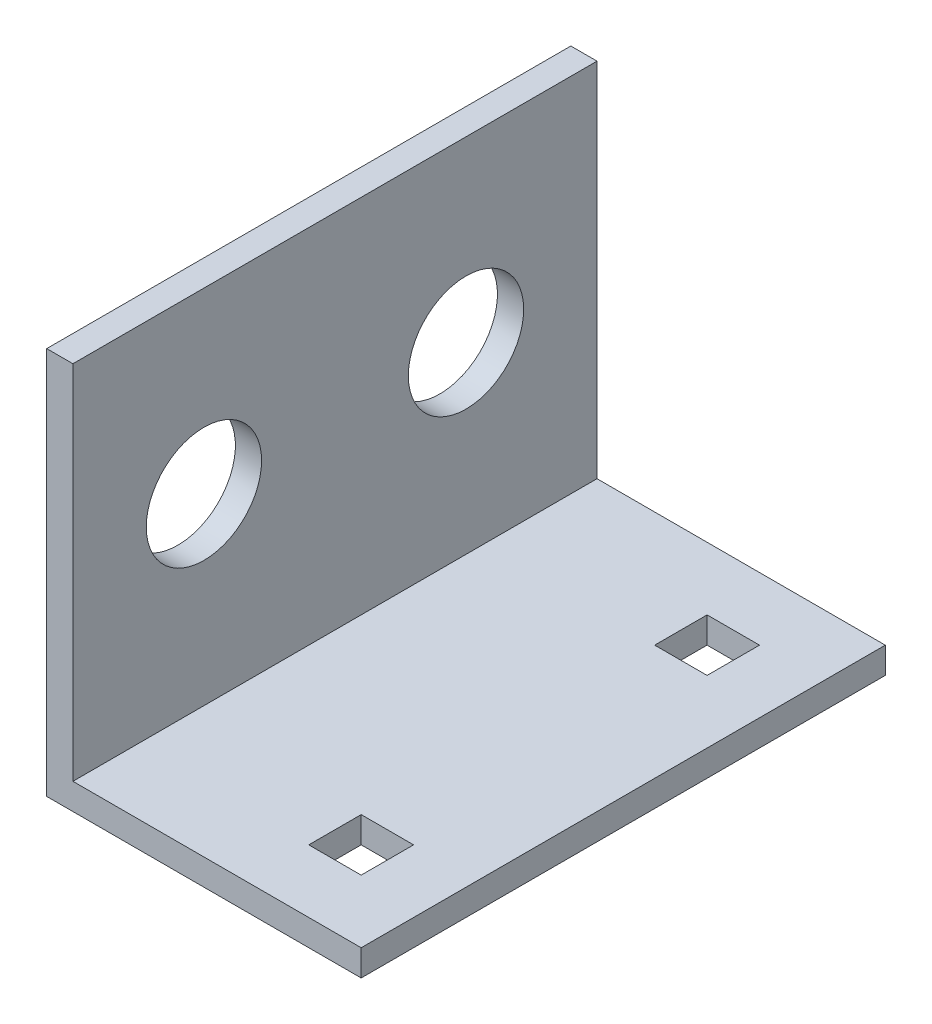
ISO-10303-21;
HEADER;
FILE_DESCRIPTION(('STEP AP214'),'2;1');
FILE_NAME('part.step','',(''),(''),'','','');
FILE_SCHEMA(('AUTOMOTIVE_DESIGN { 1 0 10303 214 1 1 1 1 }'));
ENDSEC;
DATA;
#1=APPLICATION_CONTEXT('core data for automotive mechanical design processes');
#2=APPLICATION_PROTOCOL_DEFINITION('international standard','automotive_design',2000,#1);
#3=PRODUCT_CONTEXT('',#1,'mechanical');
#4=PRODUCT('Part','Part','',(#3));
#5=PRODUCT_RELATED_PRODUCT_CATEGORY('part','',(#4));
#6=PRODUCT_DEFINITION_FORMATION('','',#4);
#7=PRODUCT_DEFINITION_CONTEXT('part definition',#1,'design');
#8=PRODUCT_DEFINITION('design','',#6,#7);
#9=PRODUCT_DEFINITION_SHAPE('','',#8);
#10=(LENGTH_UNIT() NAMED_UNIT(*) SI_UNIT(.MILLI.,.METRE.));
#11=(NAMED_UNIT(*) PLANE_ANGLE_UNIT() SI_UNIT($,.RADIAN.));
#12=(NAMED_UNIT(*) SI_UNIT($,.STERADIAN.) SOLID_ANGLE_UNIT());
#13=UNCERTAINTY_MEASURE_WITH_UNIT(LENGTH_MEASURE(1.E-05),#10,'distance_accuracy_value','');
#14=(GEOMETRIC_REPRESENTATION_CONTEXT(3) GLOBAL_UNCERTAINTY_ASSIGNED_CONTEXT((#13)) GLOBAL_UNIT_ASSIGNED_CONTEXT((#10,
#11,#12)) REPRESENTATION_CONTEXT('',''));
#15=CARTESIAN_POINT('',(0.,0.,0.));
#16=DIRECTION('',(0.,0.,1.));
#17=DIRECTION('',(1.,0.,0.));
#18=AXIS2_PLACEMENT_3D('',#15,#16,#17);
#19=CARTESIAN_POINT('',(0.,0.,-50.));
#20=DIRECTION('',(0.,-1.,0.));
#21=DIRECTION('',(0.,0.,-1.));
#22=AXIS2_PLACEMENT_3D('',#19,#20,#21);
#23=PLANE('',#22);
#24=DIRECTION('',(0.,0.,1.));
#25=VECTOR('',#24,1.);
#26=CARTESIAN_POINT('',(24.,0.,-44.));
#27=LINE('',#26,#25);
#28=CARTESIAN_POINT('',(24.,0.,-44.));
#29=VERTEX_POINT('',#28);
#30=CARTESIAN_POINT('',(24.,0.,-39.));
#31=VERTEX_POINT('',#30);
#32=EDGE_CURVE('E47',#29,#31,#27,.T.);
#33=ORIENTED_EDGE('',*,*,#32,.F.);
#34=DIRECTION('',(1.,0.,0.));
#35=VECTOR('',#34,1.);
#36=CARTESIAN_POINT('',(24.,0.,-44.));
#37=LINE('',#36,#35);
#38=CARTESIAN_POINT('',(19.,0.,-44.));
#39=VERTEX_POINT('',#38);
#40=EDGE_CURVE('E151',#39,#29,#37,.T.);
#41=ORIENTED_EDGE('',*,*,#40,.F.);
#42=DIRECTION('',(0.,0.,-1.));
#43=VECTOR('',#42,1.);
#44=CARTESIAN_POINT('',(19.,0.,-44.));
#45=LINE('',#44,#43);
#46=CARTESIAN_POINT('',(19.,0.,-39.));
#47=VERTEX_POINT('',#46);
#48=EDGE_CURVE('E136',#47,#39,#45,.T.);
#49=ORIENTED_EDGE('',*,*,#48,.F.);
#50=DIRECTION('',(-1.,0.,0.));
#51=VECTOR('',#50,1.);
#52=CARTESIAN_POINT('',(24.,0.,-39.));
#53=LINE('',#52,#51);
#54=EDGE_CURVE('E145',#31,#47,#53,.T.);
#55=ORIENTED_EDGE('',*,*,#54,.F.);
#56=EDGE_LOOP('',(#33,#41,#49,#55));
#57=FACE_BOUND('',#56,.T.);
#58=DIRECTION('',(0.,0.,1.));
#59=VECTOR('',#58,1.);
#60=CARTESIAN_POINT('',(24.,0.,-6.));
#61=LINE('',#60,#59);
#62=CARTESIAN_POINT('',(24.,0.,-11.));
#63=VERTEX_POINT('',#62);
#64=CARTESIAN_POINT('',(24.,0.,-6.));
#65=VERTEX_POINT('',#64);
#66=EDGE_CURVE('E158',#63,#65,#61,.T.);
#67=ORIENTED_EDGE('',*,*,#66,.F.);
#68=DIRECTION('',(1.,0.,0.));
#69=VECTOR('',#68,1.);
#70=CARTESIAN_POINT('',(24.,0.,-11.));
#71=LINE('',#70,#69);
#72=CARTESIAN_POINT('',(19.,0.,-11.));
#73=VERTEX_POINT('',#72);
#74=EDGE_CURVE('E168',#73,#63,#71,.T.);
#75=ORIENTED_EDGE('',*,*,#74,.F.);
#76=DIRECTION('',(0.,0.,-1.));
#77=VECTOR('',#76,1.);
#78=CARTESIAN_POINT('',(19.,0.,-6.));
#79=LINE('',#78,#77);
#80=CARTESIAN_POINT('',(19.,0.,-6.));
#81=VERTEX_POINT('',#80);
#82=EDGE_CURVE('E165',#81,#73,#79,.T.);
#83=ORIENTED_EDGE('',*,*,#82,.F.);
#84=DIRECTION('',(-1.,0.,0.));
#85=VECTOR('',#84,1.);
#86=CARTESIAN_POINT('',(24.,0.,-6.));
#87=LINE('',#86,#85);
#88=EDGE_CURVE('E162',#65,#81,#87,.T.);
#89=ORIENTED_EDGE('',*,*,#88,.F.);
#90=EDGE_LOOP('',(#67,#75,#83,#89));
#91=FACE_BOUND('',#90,.T.);
#92=DIRECTION('',(1.,0.,0.));
#93=VECTOR('',#92,1.);
#94=CARTESIAN_POINT('',(0.,0.,0.));
#95=LINE('',#94,#93);
#96=CARTESIAN_POINT('',(0.,0.,0.));
#97=VERTEX_POINT('',#96);
#98=CARTESIAN_POINT('',(30.,0.,0.));
#99=VERTEX_POINT('',#98);
#100=EDGE_CURVE('E205',#97,#99,#95,.T.);
#101=ORIENTED_EDGE('',*,*,#100,.F.);
#102=DIRECTION('',(0.,0.,1.));
#103=VECTOR('',#102,1.);
#104=CARTESIAN_POINT('',(0.,0.,-50.));
#105=LINE('',#104,#103);
#106=CARTESIAN_POINT('',(0.,0.,-50.));
#107=VERTEX_POINT('',#106);
#108=EDGE_CURVE('E221',#107,#97,#105,.T.);
#109=ORIENTED_EDGE('',*,*,#108,.F.);
#110=DIRECTION('',(1.,0.,0.));
#111=VECTOR('',#110,1.);
#112=CARTESIAN_POINT('',(0.,0.,-50.));
#113=LINE('',#112,#111);
#114=CARTESIAN_POINT('',(30.,0.,-50.));
#115=VERTEX_POINT('',#114);
#116=EDGE_CURVE('E188',#107,#115,#113,.T.);
#117=ORIENTED_EDGE('',*,*,#116,.T.);
#118=DIRECTION('',(0.,0.,1.));
#119=VECTOR('',#118,1.);
#120=CARTESIAN_POINT('',(30.,0.,-50.));
#121=LINE('',#120,#119);
#122=EDGE_CURVE('E204',#115,#99,#121,.T.);
#123=ORIENTED_EDGE('',*,*,#122,.T.);
#124=EDGE_LOOP('',(#101,#109,#117,#123));
#125=FACE_BOUND('',#124,.T.);
#126=ADVANCED_FACE('F33',(#57,#91,#125),#23,.T.);
#127=CARTESIAN_POINT('',(0.,0.,-50.));
#128=DIRECTION('',(1.,0.,0.));
#129=DIRECTION('',(0.,0.,-1.));
#130=AXIS2_PLACEMENT_3D('',#127,#128,#129);
#131=PLANE('',#130);
#132=CARTESIAN_POINT('',(0.,20.,-12.5));
#133=DIRECTION('',(-1.,0.,0.));
#134=DIRECTION('',(0.,0.,1.));
#135=AXIS2_PLACEMENT_3D('',#132,#133,#134);
#136=CIRCLE('',#135,5.5);
#137=CARTESIAN_POINT('',(0.,20.,-7.));
#138=VERTEX_POINT('',#137);
#139=EDGE_CURVE('E174',#138,#138,#136,.T.);
#140=ORIENTED_EDGE('',*,*,#139,.F.);
#141=EDGE_LOOP('',(#140));
#142=FACE_BOUND('',#141,.T.);
#143=CARTESIAN_POINT('',(0.,20.,-37.5));
#144=DIRECTION('',(-1.,0.,0.));
#145=DIRECTION('',(0.,0.,1.));
#146=AXIS2_PLACEMENT_3D('',#143,#144,#145);
#147=CIRCLE('',#146,5.5);
#148=CARTESIAN_POINT('',(0.,20.,-32.));
#149=VERTEX_POINT('',#148);
#150=EDGE_CURVE('E184',#149,#149,#147,.T.);
#151=ORIENTED_EDGE('',*,*,#150,.F.);
#152=EDGE_LOOP('',(#151));
#153=FACE_BOUND('',#152,.T.);
#154=DIRECTION('',(0.,1.,0.));
#155=VECTOR('',#154,1.);
#156=CARTESIAN_POINT('',(0.,0.,0.));
#157=LINE('',#156,#155);
#158=CARTESIAN_POINT('',(0.,37.,0.));
#159=VERTEX_POINT('',#158);
#160=EDGE_CURVE('E192',#97,#159,#157,.T.);
#161=ORIENTED_EDGE('',*,*,#160,.T.);
#162=DIRECTION('',(0.,0.,1.));
#163=VECTOR('',#162,1.);
#164=CARTESIAN_POINT('',(0.,37.,-50.));
#165=LINE('',#164,#163);
#166=CARTESIAN_POINT('',(0.,37.,-50.));
#167=VERTEX_POINT('',#166);
#168=EDGE_CURVE('E224',#167,#159,#165,.T.);
#169=ORIENTED_EDGE('',*,*,#168,.F.);
#170=DIRECTION('',(0.,1.,0.));
#171=VECTOR('',#170,1.);
#172=CARTESIAN_POINT('',(0.,0.,-50.));
#173=LINE('',#172,#171);
#174=EDGE_CURVE('E202',#107,#167,#173,.T.);
#175=ORIENTED_EDGE('',*,*,#174,.F.);
#176=ORIENTED_EDGE('',*,*,#108,.T.);
#177=EDGE_LOOP('',(#161,#169,#175,#176));
#178=FACE_BOUND('',#177,.T.);
#179=ADVANCED_FACE('F273',(#142,#153,#178),#131,.F.);
#180=CARTESIAN_POINT('',(0.,37.,-50.));
#181=DIRECTION('',(0.,-1.,0.));
#182=DIRECTION('',(0.,0.,-1.));
#183=AXIS2_PLACEMENT_3D('',#180,#181,#182);
#184=PLANE('',#183);
#185=DIRECTION('',(1.,0.,0.));
#186=VECTOR('',#185,1.);
#187=CARTESIAN_POINT('',(0.,37.,0.));
#188=LINE('',#187,#186);
#189=CARTESIAN_POINT('',(2.5,37.,0.));
#190=VERTEX_POINT('',#189);
#191=EDGE_CURVE('E217',#159,#190,#188,.T.);
#192=ORIENTED_EDGE('',*,*,#191,.T.);
#193=DIRECTION('',(0.,0.,1.));
#194=VECTOR('',#193,1.);
#195=CARTESIAN_POINT('',(2.5,37.,-50.));
#196=LINE('',#195,#194);
#197=CARTESIAN_POINT('',(2.5,37.,-50.));
#198=VERTEX_POINT('',#197);
#199=EDGE_CURVE('E227',#198,#190,#196,.T.);
#200=ORIENTED_EDGE('',*,*,#199,.F.);
#201=DIRECTION('',(1.,0.,0.));
#202=VECTOR('',#201,1.);
#203=CARTESIAN_POINT('',(0.,37.,-50.));
#204=LINE('',#203,#202);
#205=EDGE_CURVE('E200',#167,#198,#204,.T.);
#206=ORIENTED_EDGE('',*,*,#205,.F.);
#207=ORIENTED_EDGE('',*,*,#168,.T.);
#208=EDGE_LOOP('',(#192,#200,#206,#207));
#209=FACE_BOUND('',#208,.T.);
#210=ADVANCED_FACE('F277',(#209),#184,.F.);
#211=CARTESIAN_POINT('',(2.5,0.,-50.));
#212=DIRECTION('',(1.,0.,0.));
#213=DIRECTION('',(0.,0.,-1.));
#214=AXIS2_PLACEMENT_3D('',#211,#212,#213);
#215=PLANE('',#214);
#216=CARTESIAN_POINT('',(2.5,20.,-12.5));
#217=DIRECTION('',(1.,0.,0.));
#218=DIRECTION('',(0.,0.,-1.));
#219=AXIS2_PLACEMENT_3D('',#216,#217,#218);
#220=CIRCLE('',#219,5.5);
#221=CARTESIAN_POINT('',(2.5,20.,-18.));
#222=VERTEX_POINT('',#221);
#223=EDGE_CURVE('E183',#222,#222,#220,.T.);
#224=ORIENTED_EDGE('',*,*,#223,.F.);
#225=EDGE_LOOP('',(#224));
#226=FACE_BOUND('',#225,.T.);
#227=CARTESIAN_POINT('',(2.5,20.,-37.5));
#228=DIRECTION('',(1.,0.,0.));
#229=DIRECTION('',(0.,0.,-1.));
#230=AXIS2_PLACEMENT_3D('',#227,#228,#229);
#231=CIRCLE('',#230,5.5);
#232=CARTESIAN_POINT('',(2.5,20.,-43.));
#233=VERTEX_POINT('',#232);
#234=EDGE_CURVE('E187',#233,#233,#231,.T.);
#235=ORIENTED_EDGE('',*,*,#234,.F.);
#236=EDGE_LOOP('',(#235));
#237=FACE_BOUND('',#236,.T.);
#238=DIRECTION('',(0.,1.,0.));
#239=VECTOR('',#238,1.);
#240=CARTESIAN_POINT('',(2.5,0.,0.));
#241=LINE('',#240,#239);
#242=CARTESIAN_POINT('',(2.5,2.5,0.));
#243=VERTEX_POINT('',#242);
#244=EDGE_CURVE('E214',#243,#190,#241,.T.);
#245=ORIENTED_EDGE('',*,*,#244,.F.);
#246=DIRECTION('',(0.,0.,1.));
#247=VECTOR('',#246,1.);
#248=CARTESIAN_POINT('',(2.5,2.5,-50.));
#249=LINE('',#248,#247);
#250=CARTESIAN_POINT('',(2.5,2.5,-50.));
#251=VERTEX_POINT('',#250);
#252=EDGE_CURVE('E229',#251,#243,#249,.T.);
#253=ORIENTED_EDGE('',*,*,#252,.F.);
#254=DIRECTION('',(0.,1.,0.));
#255=VECTOR('',#254,1.);
#256=CARTESIAN_POINT('',(2.5,0.,-50.));
#257=LINE('',#256,#255);
#258=EDGE_CURVE('E197',#251,#198,#257,.T.);
#259=ORIENTED_EDGE('',*,*,#258,.T.);
#260=ORIENTED_EDGE('',*,*,#199,.T.);
#261=EDGE_LOOP('',(#245,#253,#259,#260));
#262=FACE_BOUND('',#261,.T.);
#263=ADVANCED_FACE('F283',(#226,#237,#262),#215,.T.);
#264=CARTESIAN_POINT('',(0.,2.5,-50.));
#265=DIRECTION('',(0.,-1.,0.));
#266=DIRECTION('',(0.,0.,-1.));
#267=AXIS2_PLACEMENT_3D('',#264,#265,#266);
#268=PLANE('',#267);
#269=DIRECTION('',(1.,0.,0.));
#270=VECTOR('',#269,1.);
#271=CARTESIAN_POINT('',(0.,2.5,-44.));
#272=LINE('',#271,#270);
#273=CARTESIAN_POINT('',(19.,2.5,-44.));
#274=VERTEX_POINT('',#273);
#275=CARTESIAN_POINT('',(24.,2.5,-44.));
#276=VERTEX_POINT('',#275);
#277=EDGE_CURVE('E40',#274,#276,#272,.T.);
#278=ORIENTED_EDGE('',*,*,#277,.T.);
#279=DIRECTION('',(0.,0.,1.));
#280=VECTOR('',#279,1.);
#281=CARTESIAN_POINT('',(24.,2.5,-50.));
#282=LINE('',#281,#280);
#283=CARTESIAN_POINT('',(24.,2.5,-39.));
#284=VERTEX_POINT('',#283);
#285=EDGE_CURVE('E11',#276,#284,#282,.T.);
#286=ORIENTED_EDGE('',*,*,#285,.T.);
#287=DIRECTION('',(-1.,0.,0.));
#288=VECTOR('',#287,1.);
#289=CARTESIAN_POINT('',(0.,2.5,-39.));
#290=LINE('',#289,#288);
#291=CARTESIAN_POINT('',(19.,2.5,-39.));
#292=VERTEX_POINT('',#291);
#293=EDGE_CURVE('E249',#284,#292,#290,.T.);
#294=ORIENTED_EDGE('',*,*,#293,.T.);
#295=DIRECTION('',(0.,0.,-1.));
#296=VECTOR('',#295,1.);
#297=CARTESIAN_POINT('',(19.,2.5,-50.));
#298=LINE('',#297,#296);
#299=EDGE_CURVE('E139',#292,#274,#298,.T.);
#300=ORIENTED_EDGE('',*,*,#299,.T.);
#301=EDGE_LOOP('',(#278,#286,#294,#300));
#302=FACE_BOUND('',#301,.T.);
#303=DIRECTION('',(1.,0.,0.));
#304=VECTOR('',#303,1.);
#305=CARTESIAN_POINT('',(0.,2.5,-11.));
#306=LINE('',#305,#304);
#307=CARTESIAN_POINT('',(19.,2.5,-11.));
#308=VERTEX_POINT('',#307);
#309=CARTESIAN_POINT('',(24.,2.5,-11.));
#310=VERTEX_POINT('',#309);
#311=EDGE_CURVE('E243',#308,#310,#306,.T.);
#312=ORIENTED_EDGE('',*,*,#311,.T.);
#313=DIRECTION('',(0.,0.,1.));
#314=VECTOR('',#313,1.);
#315=CARTESIAN_POINT('',(24.,2.5,-50.));
#316=LINE('',#315,#314);
#317=CARTESIAN_POINT('',(24.,2.5,-6.));
#318=VERTEX_POINT('',#317);
#319=EDGE_CURVE('E246',#310,#318,#316,.T.);
#320=ORIENTED_EDGE('',*,*,#319,.T.);
#321=DIRECTION('',(-1.,0.,0.));
#322=VECTOR('',#321,1.);
#323=CARTESIAN_POINT('',(0.,2.5,-6.00000000000001));
#324=LINE('',#323,#322);
#325=CARTESIAN_POINT('',(19.,2.5,-6.));
#326=VERTEX_POINT('',#325);
#327=EDGE_CURVE('E223',#318,#326,#324,.T.);
#328=ORIENTED_EDGE('',*,*,#327,.T.);
#329=DIRECTION('',(0.,0.,-1.));
#330=VECTOR('',#329,1.);
#331=CARTESIAN_POINT('',(19.,2.5,-50.));
#332=LINE('',#331,#330);
#333=EDGE_CURVE('E240',#326,#308,#332,.T.);
#334=ORIENTED_EDGE('',*,*,#333,.T.);
#335=EDGE_LOOP('',(#312,#320,#328,#334));
#336=FACE_BOUND('',#335,.T.);
#337=DIRECTION('',(1.,0.,0.));
#338=VECTOR('',#337,1.);
#339=CARTESIAN_POINT('',(0.,2.5,0.));
#340=LINE('',#339,#338);
#341=CARTESIAN_POINT('',(30.,2.5,0.));
#342=VERTEX_POINT('',#341);
#343=EDGE_CURVE('E211',#243,#342,#340,.T.);
#344=ORIENTED_EDGE('',*,*,#343,.T.);
#345=DIRECTION('',(0.,0.,1.));
#346=VECTOR('',#345,1.);
#347=CARTESIAN_POINT('',(30.,2.5,-50.));
#348=LINE('',#347,#346);
#349=CARTESIAN_POINT('',(30.,2.5,-50.));
#350=VERTEX_POINT('',#349);
#351=EDGE_CURVE('E231',#350,#342,#348,.T.);
#352=ORIENTED_EDGE('',*,*,#351,.F.);
#353=DIRECTION('',(1.,0.,0.));
#354=VECTOR('',#353,1.);
#355=CARTESIAN_POINT('',(0.,2.5,-50.));
#356=LINE('',#355,#354);
#357=EDGE_CURVE('E195',#251,#350,#356,.T.);
#358=ORIENTED_EDGE('',*,*,#357,.F.);
#359=ORIENTED_EDGE('',*,*,#252,.T.);
#360=EDGE_LOOP('',(#344,#352,#358,#359));
#361=FACE_BOUND('',#360,.T.);
#362=ADVANCED_FACE('F253',(#302,#336,#361),#268,.F.);
#363=CARTESIAN_POINT('',(30.,0.,-50.));
#364=DIRECTION('',(1.,0.,0.));
#365=DIRECTION('',(0.,0.,-1.));
#366=AXIS2_PLACEMENT_3D('',#363,#364,#365);
#367=PLANE('',#366);
#368=DIRECTION('',(0.,1.,0.));
#369=VECTOR('',#368,1.);
#370=CARTESIAN_POINT('',(30.,0.,0.));
#371=LINE('',#370,#369);
#372=EDGE_CURVE('E208',#99,#342,#371,.T.);
#373=ORIENTED_EDGE('',*,*,#372,.F.);
#374=ORIENTED_EDGE('',*,*,#122,.F.);
#375=DIRECTION('',(0.,1.,0.));
#376=VECTOR('',#375,1.);
#377=CARTESIAN_POINT('',(30.,0.,-50.));
#378=LINE('',#377,#376);
#379=EDGE_CURVE('E191',#115,#350,#378,.T.);
#380=ORIENTED_EDGE('',*,*,#379,.T.);
#381=ORIENTED_EDGE('',*,*,#351,.T.);
#382=EDGE_LOOP('',(#373,#374,#380,#381));
#383=FACE_BOUND('',#382,.T.);
#384=ADVANCED_FACE('F296',(#383),#367,.T.);
#385=CARTESIAN_POINT('',(0.,0.,-50.));
#386=DIRECTION('',(0.,0.,1.));
#387=DIRECTION('',(1.,0.,0.));
#388=AXIS2_PLACEMENT_3D('',#385,#386,#387);
#389=PLANE('',#388);
#390=ORIENTED_EDGE('',*,*,#116,.F.);
#391=ORIENTED_EDGE('',*,*,#174,.T.);
#392=ORIENTED_EDGE('',*,*,#205,.T.);
#393=ORIENTED_EDGE('',*,*,#258,.F.);
#394=ORIENTED_EDGE('',*,*,#357,.T.);
#395=ORIENTED_EDGE('',*,*,#379,.F.);
#396=EDGE_LOOP('',(#390,#391,#392,#393,#394,#395));
#397=FACE_BOUND('',#396,.T.);
#398=ADVANCED_FACE('F298',(#397),#389,.F.);
#399=CARTESIAN_POINT('',(0.,0.,0.));
#400=DIRECTION('',(0.,0.,1.));
#401=DIRECTION('',(1.,0.,0.));
#402=AXIS2_PLACEMENT_3D('',#399,#400,#401);
#403=PLANE('',#402);
#404=ORIENTED_EDGE('',*,*,#100,.T.);
#405=ORIENTED_EDGE('',*,*,#372,.T.);
#406=ORIENTED_EDGE('',*,*,#343,.F.);
#407=ORIENTED_EDGE('',*,*,#244,.T.);
#408=ORIENTED_EDGE('',*,*,#191,.F.);
#409=ORIENTED_EDGE('',*,*,#160,.F.);
#410=EDGE_LOOP('',(#404,#405,#406,#407,#408,#409));
#411=FACE_BOUND('',#410,.T.);
#412=ADVANCED_FACE('F289',(#411),#403,.T.);
#413=CARTESIAN_POINT('',(30.,20.,-37.5));
#414=DIRECTION('',(-1.,0.,0.));
#415=DIRECTION('',(0.,0.,1.));
#416=AXIS2_PLACEMENT_3D('',#413,#414,#415);
#417=CYLINDRICAL_SURFACE('',#416,5.5);
#418=ORIENTED_EDGE('',*,*,#234,.T.);
#419=EDGE_LOOP('',(#418));
#420=FACE_BOUND('',#419,.T.);
#421=ORIENTED_EDGE('',*,*,#150,.T.);
#422=EDGE_LOOP('',(#421));
#423=FACE_BOUND('',#422,.T.);
#424=ADVANCED_FACE('F325',(#420,#423),#417,.F.);
#425=CARTESIAN_POINT('',(30.,20.,-12.5));
#426=DIRECTION('',(-1.,0.,0.));
#427=DIRECTION('',(0.,0.,1.));
#428=AXIS2_PLACEMENT_3D('',#425,#426,#427);
#429=CYLINDRICAL_SURFACE('',#428,5.5);
#430=ORIENTED_EDGE('',*,*,#223,.T.);
#431=EDGE_LOOP('',(#430));
#432=FACE_BOUND('',#431,.T.);
#433=ORIENTED_EDGE('',*,*,#139,.T.);
#434=EDGE_LOOP('',(#433));
#435=FACE_BOUND('',#434,.T.);
#436=ADVANCED_FACE('F329',(#432,#435),#429,.F.);
#437=CARTESIAN_POINT('',(24.,50.,-6.));
#438=DIRECTION('',(1.,0.,0.));
#439=DIRECTION('',(0.,0.,-1.));
#440=AXIS2_PLACEMENT_3D('',#437,#438,#439);
#441=PLANE('',#440);
#442=DIRECTION('',(0.,-1.,0.));
#443=VECTOR('',#442,1.);
#444=CARTESIAN_POINT('',(24.,50.,-11.));
#445=LINE('',#444,#443);
#446=EDGE_CURVE('E172',#310,#63,#445,.T.);
#447=ORIENTED_EDGE('',*,*,#446,.T.);
#448=ORIENTED_EDGE('',*,*,#66,.T.);
#449=DIRECTION('',(0.,-1.,0.));
#450=VECTOR('',#449,1.);
#451=CARTESIAN_POINT('',(24.,50.,-6.));
#452=LINE('',#451,#450);
#453=EDGE_CURVE('E171',#318,#65,#452,.T.);
#454=ORIENTED_EDGE('',*,*,#453,.F.);
#455=ORIENTED_EDGE('',*,*,#319,.F.);
#456=EDGE_LOOP('',(#447,#448,#454,#455));
#457=FACE_BOUND('',#456,.T.);
#458=ADVANCED_FACE('F335',(#457),#441,.F.);
#459=CARTESIAN_POINT('',(24.,50.,-11.));
#460=DIRECTION('',(0.,0.,-1.));
#461=DIRECTION('',(-1.,0.,0.));
#462=AXIS2_PLACEMENT_3D('',#459,#460,#461);
#463=PLANE('',#462);
#464=DIRECTION('',(0.,-1.,0.));
#465=VECTOR('',#464,1.);
#466=CARTESIAN_POINT('',(19.,50.,-11.));
#467=LINE('',#466,#465);
#468=EDGE_CURVE('E175',#308,#73,#467,.T.);
#469=ORIENTED_EDGE('',*,*,#468,.T.);
#470=ORIENTED_EDGE('',*,*,#74,.T.);
#471=ORIENTED_EDGE('',*,*,#446,.F.);
#472=ORIENTED_EDGE('',*,*,#311,.F.);
#473=EDGE_LOOP('',(#469,#470,#471,#472));
#474=FACE_BOUND('',#473,.T.);
#475=ADVANCED_FACE('F341',(#474),#463,.F.);
#476=CARTESIAN_POINT('',(19.,50.,-6.));
#477=DIRECTION('',(-1.,0.,0.));
#478=DIRECTION('',(0.,0.,1.));
#479=AXIS2_PLACEMENT_3D('',#476,#477,#478);
#480=PLANE('',#479);
#481=DIRECTION('',(0.,-1.,0.));
#482=VECTOR('',#481,1.);
#483=CARTESIAN_POINT('',(19.,50.,-6.));
#484=LINE('',#483,#482);
#485=EDGE_CURVE('E177',#326,#81,#484,.T.);
#486=ORIENTED_EDGE('',*,*,#485,.T.);
#487=ORIENTED_EDGE('',*,*,#82,.T.);
#488=ORIENTED_EDGE('',*,*,#468,.F.);
#489=ORIENTED_EDGE('',*,*,#333,.F.);
#490=EDGE_LOOP('',(#486,#487,#488,#489));
#491=FACE_BOUND('',#490,.T.);
#492=ADVANCED_FACE('F267',(#491),#480,.F.);
#493=CARTESIAN_POINT('',(24.,50.,-6.));
#494=DIRECTION('',(0.,0.,1.));
#495=DIRECTION('',(1.,0.,0.));
#496=AXIS2_PLACEMENT_3D('',#493,#494,#495);
#497=PLANE('',#496);
#498=ORIENTED_EDGE('',*,*,#453,.T.);
#499=ORIENTED_EDGE('',*,*,#88,.T.);
#500=ORIENTED_EDGE('',*,*,#485,.F.);
#501=ORIENTED_EDGE('',*,*,#327,.F.);
#502=EDGE_LOOP('',(#498,#499,#500,#501));
#503=FACE_BOUND('',#502,.T.);
#504=ADVANCED_FACE('F260',(#503),#497,.F.);
#505=CARTESIAN_POINT('',(24.,50.,-44.));
#506=DIRECTION('',(1.,0.,0.));
#507=DIRECTION('',(0.,0.,-1.));
#508=AXIS2_PLACEMENT_3D('',#505,#506,#507);
#509=PLANE('',#508);
#510=DIRECTION('',(0.,-1.,0.));
#511=VECTOR('',#510,1.);
#512=CARTESIAN_POINT('',(24.,50.,-44.));
#513=LINE('',#512,#511);
#514=EDGE_CURVE('E156',#276,#29,#513,.T.);
#515=ORIENTED_EDGE('',*,*,#514,.T.);
#516=ORIENTED_EDGE('',*,*,#32,.T.);
#517=DIRECTION('',(0.,-1.,0.));
#518=VECTOR('',#517,1.);
#519=CARTESIAN_POINT('',(24.,50.,-39.));
#520=LINE('',#519,#518);
#521=EDGE_CURVE('E142',#284,#31,#520,.T.);
#522=ORIENTED_EDGE('',*,*,#521,.F.);
#523=ORIENTED_EDGE('',*,*,#285,.F.);
#524=EDGE_LOOP('',(#515,#516,#522,#523));
#525=FACE_BOUND('',#524,.T.);
#526=ADVANCED_FACE('F258',(#525),#509,.F.);
#527=CARTESIAN_POINT('',(24.,50.,-44.));
#528=DIRECTION('',(0.,0.,-1.));
#529=DIRECTION('',(-1.,0.,0.));
#530=AXIS2_PLACEMENT_3D('',#527,#528,#529);
#531=PLANE('',#530);
#532=DIRECTION('',(0.,-1.,0.));
#533=VECTOR('',#532,1.);
#534=CARTESIAN_POINT('',(19.,50.,-44.));
#535=LINE('',#534,#533);
#536=EDGE_CURVE('E141',#274,#39,#535,.T.);
#537=ORIENTED_EDGE('',*,*,#536,.T.);
#538=ORIENTED_EDGE('',*,*,#40,.T.);
#539=ORIENTED_EDGE('',*,*,#514,.F.);
#540=ORIENTED_EDGE('',*,*,#277,.F.);
#541=EDGE_LOOP('',(#537,#538,#539,#540));
#542=FACE_BOUND('',#541,.T.);
#543=ADVANCED_FACE('F257',(#542),#531,.F.);
#544=CARTESIAN_POINT('',(19.,50.,-44.));
#545=DIRECTION('',(-1.,0.,0.));
#546=DIRECTION('',(0.,0.,1.));
#547=AXIS2_PLACEMENT_3D('',#544,#545,#546);
#548=PLANE('',#547);
#549=DIRECTION('',(0.,-1.,0.));
#550=VECTOR('',#549,1.);
#551=CARTESIAN_POINT('',(19.,50.,-39.));
#552=LINE('',#551,#550);
#553=EDGE_CURVE('E55',#292,#47,#552,.T.);
#554=ORIENTED_EDGE('',*,*,#553,.T.);
#555=ORIENTED_EDGE('',*,*,#48,.T.);
#556=ORIENTED_EDGE('',*,*,#536,.F.);
#557=ORIENTED_EDGE('',*,*,#299,.F.);
#558=EDGE_LOOP('',(#554,#555,#556,#557));
#559=FACE_BOUND('',#558,.T.);
#560=ADVANCED_FACE('F133',(#559),#548,.F.);
#561=CARTESIAN_POINT('',(24.,50.,-39.));
#562=DIRECTION('',(0.,0.,1.));
#563=DIRECTION('',(1.,0.,0.));
#564=AXIS2_PLACEMENT_3D('',#561,#562,#563);
#565=PLANE('',#564);
#566=ORIENTED_EDGE('',*,*,#521,.T.);
#567=ORIENTED_EDGE('',*,*,#54,.T.);
#568=ORIENTED_EDGE('',*,*,#553,.F.);
#569=ORIENTED_EDGE('',*,*,#293,.F.);
#570=EDGE_LOOP('',(#566,#567,#568,#569));
#571=FACE_BOUND('',#570,.T.);
#572=ADVANCED_FACE('F146',(#571),#565,.F.);
#573=CLOSED_SHELL('',(#126,#179,#210,#263,#362,#384,#398,#412,#424,#436,#458,#475,#492,#504,
#526,#543,#560,#572));
#574=MANIFOLD_SOLID_BREP('B2',#573);
#575=ADVANCED_BREP_SHAPE_REPRESENTATION('',(#18,#574),#14);
#576=SHAPE_DEFINITION_REPRESENTATION(#9,#575);
ENDSEC;
END-ISO-10303-21;
